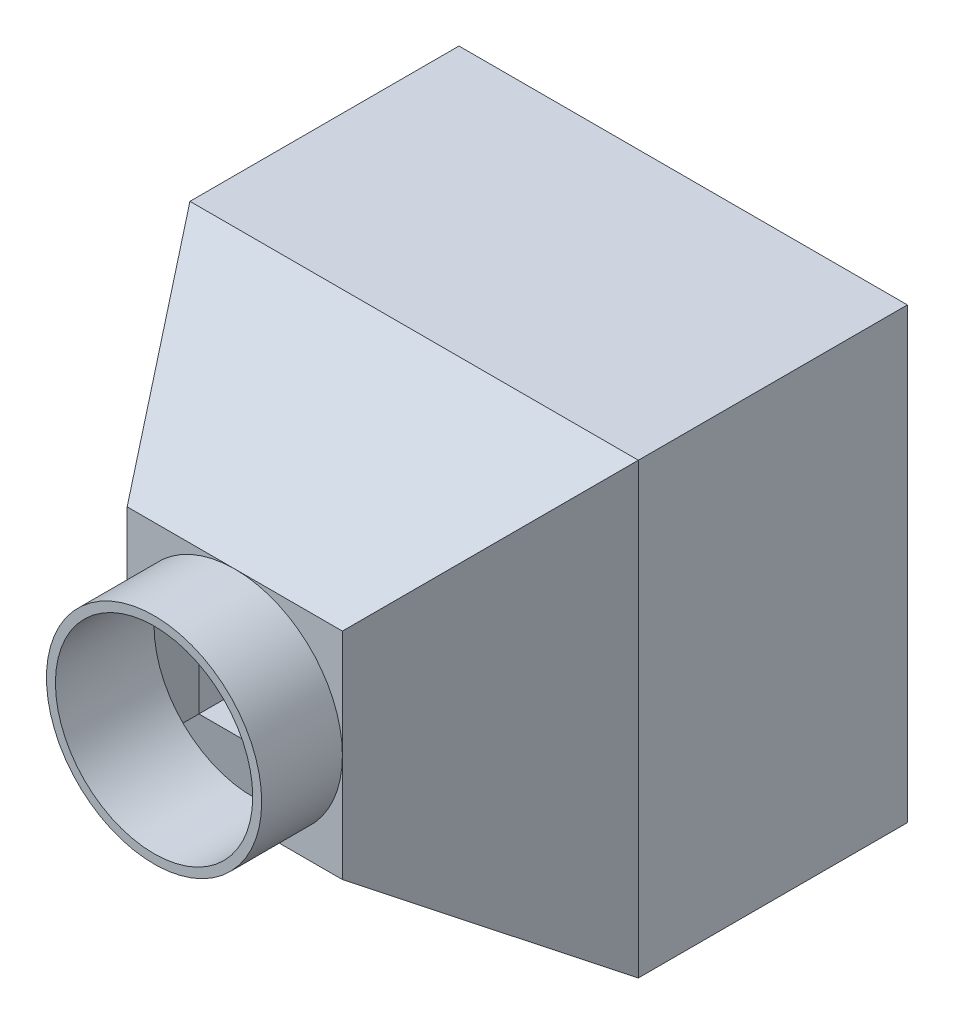
ISO-10303-21;
HEADER;
FILE_DESCRIPTION(('STEP AP214'),'2;1');
FILE_NAME('part.step','',(''),(''),'','','');
FILE_SCHEMA(('AUTOMOTIVE_DESIGN { 1 0 10303 214 1 1 1 1 }'));
ENDSEC;
DATA;
#1=APPLICATION_CONTEXT('core data for automotive mechanical design processes');
#2=APPLICATION_PROTOCOL_DEFINITION('international standard','automotive_design',2000,#1);
#3=PRODUCT_CONTEXT('',#1,'mechanical');
#4=PRODUCT('Part','Part','',(#3));
#5=PRODUCT_RELATED_PRODUCT_CATEGORY('part','',(#4));
#6=PRODUCT_DEFINITION_FORMATION('','',#4);
#7=PRODUCT_DEFINITION_CONTEXT('part definition',#1,'design');
#8=PRODUCT_DEFINITION('design','',#6,#7);
#9=PRODUCT_DEFINITION_SHAPE('','',#8);
#10=(LENGTH_UNIT() NAMED_UNIT(*) SI_UNIT(.MILLI.,.METRE.));
#11=(NAMED_UNIT(*) PLANE_ANGLE_UNIT() SI_UNIT($,.RADIAN.));
#12=(NAMED_UNIT(*) SI_UNIT($,.STERADIAN.) SOLID_ANGLE_UNIT());
#13=UNCERTAINTY_MEASURE_WITH_UNIT(LENGTH_MEASURE(1.E-05),#10,'distance_accuracy_value','');
#14=(GEOMETRIC_REPRESENTATION_CONTEXT(3) GLOBAL_UNCERTAINTY_ASSIGNED_CONTEXT((#13)) GLOBAL_UNIT_ASSIGNED_CONTEXT((#10,
#11,#12)) REPRESENTATION_CONTEXT('',''));
#15=CARTESIAN_POINT('',(0.,0.,0.));
#16=DIRECTION('',(0.,0.,1.));
#17=DIRECTION('',(1.,0.,0.));
#18=AXIS2_PLACEMENT_3D('',#15,#16,#17);
#19=CARTESIAN_POINT('',(0.,0.,59.));
#20=DIRECTION('',(0.,0.,-1.));
#21=DIRECTION('',(-1.,0.,0.));
#22=AXIS2_PLACEMENT_3D('',#19,#20,#21);
#23=CYLINDRICAL_SURFACE('',#22,11.);
#24=CARTESIAN_POINT('',(0.,0.,59.));
#25=DIRECTION('',(0.,0.,1.));
#26=DIRECTION('',(1.,0.,0.));
#27=AXIS2_PLACEMENT_3D('',#24,#25,#26);
#28=CIRCLE('',#27,11.);
#29=CARTESIAN_POINT('',(11.,0.,59.));
#30=VERTEX_POINT('',#29);
#31=EDGE_CURVE('E220',#30,#30,#28,.T.);
#32=ORIENTED_EDGE('',*,*,#31,.T.);
#33=EDGE_LOOP('',(#32));
#34=FACE_BOUND('',#33,.T.);
#35=CARTESIAN_POINT('',(0.,0.,48.));
#36=DIRECTION('',(0.,0.,-1.));
#37=DIRECTION('',(-1.,0.,0.));
#38=AXIS2_PLACEMENT_3D('',#35,#36,#37);
#39=CIRCLE('',#38,11.);
#40=CARTESIAN_POINT('',(-11.,0.,48.));
#41=VERTEX_POINT('',#40);
#42=EDGE_CURVE('E41',#41,#41,#39,.T.);
#43=ORIENTED_EDGE('',*,*,#42,.T.);
#44=EDGE_LOOP('',(#43));
#45=FACE_BOUND('',#44,.T.);
#46=ADVANCED_FACE('F37',(#34,#45),#23,.F.);
#47=CARTESIAN_POINT('',(0.,0.,50.));
#48=DIRECTION('',(0.,0.,1.));
#49=DIRECTION('',(1.,0.,0.));
#50=AXIS2_PLACEMENT_3D('',#47,#48,#49);
#51=PLANE('',#50);
#52=DIRECTION('',(1.,0.,0.));
#53=VECTOR('',#52,1.);
#54=CARTESIAN_POINT('',(-48.8537208837531,-12.,50.));
#55=LINE('',#54,#53);
#56=CARTESIAN_POINT('',(0.,-12.,50.));
#57=VERTEX_POINT('',#56);
#58=CARTESIAN_POINT('',(12.,-12.,50.));
#59=VERTEX_POINT('',#58);
#60=EDGE_CURVE('E190',#57,#59,#55,.T.);
#61=ORIENTED_EDGE('',*,*,#60,.T.);
#62=DIRECTION('',(0.,-1.,0.));
#63=VECTOR('',#62,1.);
#64=CARTESIAN_POINT('',(12.,48.8537208837531,50.));
#65=LINE('',#64,#63);
#66=CARTESIAN_POINT('',(12.,0.,50.));
#67=VERTEX_POINT('',#66);
#68=EDGE_CURVE('E214',#67,#59,#65,.T.);
#69=ORIENTED_EDGE('',*,*,#68,.F.);
#70=CARTESIAN_POINT('',(0.,0.,50.));
#71=DIRECTION('',(0.,0.,1.));
#72=DIRECTION('',(1.,0.,0.));
#73=AXIS2_PLACEMENT_3D('',#70,#71,#72);
#74=CIRCLE('',#73,12.);
#75=EDGE_CURVE('E234',#57,#67,#74,.T.);
#76=ORIENTED_EDGE('',*,*,#75,.F.);
#77=EDGE_LOOP('',(#61,#69,#76));
#78=FACE_BOUND('',#77,.T.);
#79=ADVANCED_FACE('F284',(#78),#51,.T.);
#80=DIRECTION('',(1.,0.,0.));
#81=VECTOR('',#80,1.);
#82=CARTESIAN_POINT('',(-48.8537208837531,12.,50.));
#83=LINE('',#82,#81);
#84=CARTESIAN_POINT('',(-12.,12.,50.));
#85=VERTEX_POINT('',#84);
#86=CARTESIAN_POINT('',(0.,12.,50.));
#87=VERTEX_POINT('',#86);
#88=EDGE_CURVE('E203',#85,#87,#83,.T.);
#89=ORIENTED_EDGE('',*,*,#88,.F.);
#90=DIRECTION('',(0.,-1.,0.));
#91=VECTOR('',#90,1.);
#92=CARTESIAN_POINT('',(-12.,48.8537208837531,50.));
#93=LINE('',#92,#91);
#94=CARTESIAN_POINT('',(-12.,0.,50.));
#95=VERTEX_POINT('',#94);
#96=EDGE_CURVE('E221',#85,#95,#93,.T.);
#97=ORIENTED_EDGE('',*,*,#96,.T.);
#98=EDGE_CURVE('E226',#87,#95,#74,.T.);
#99=ORIENTED_EDGE('',*,*,#98,.F.);
#100=EDGE_LOOP('',(#89,#97,#99));
#101=FACE_BOUND('',#100,.T.);
#102=ADVANCED_FACE('F274',(#101),#51,.T.);
#103=CARTESIAN_POINT('',(12.,12.,50.));
#104=VERTEX_POINT('',#103);
#105=EDGE_CURVE('E61',#87,#104,#83,.T.);
#106=ORIENTED_EDGE('',*,*,#105,.F.);
#107=EDGE_CURVE('E235',#67,#87,#74,.T.);
#108=ORIENTED_EDGE('',*,*,#107,.F.);
#109=EDGE_CURVE('E210',#104,#67,#65,.T.);
#110=ORIENTED_EDGE('',*,*,#109,.F.);
#111=EDGE_LOOP('',(#106,#108,#110));
#112=FACE_BOUND('',#111,.T.);
#113=ADVANCED_FACE('F264',(#112),#51,.T.);
#114=CARTESIAN_POINT('',(-25.,25.,50.));
#115=DIRECTION('',(1.,0.,0.));
#116=DIRECTION('',(0.,1.,0.));
#117=AXIS2_PLACEMENT_3D('',#114,#115,#116);
#118=PLANE('',#117);
#119=DIRECTION('',(0.,0.,-1.));
#120=VECTOR('',#119,1.);
#121=CARTESIAN_POINT('',(-25.,-25.,50.));
#122=LINE('',#121,#120);
#123=CARTESIAN_POINT('',(-25.,-25.,30.));
#124=VERTEX_POINT('',#123);
#125=CARTESIAN_POINT('',(-25.,-25.,0.));
#126=VERTEX_POINT('',#125);
#127=EDGE_CURVE('E253',#124,#126,#122,.T.);
#128=ORIENTED_EDGE('',*,*,#127,.F.);
#129=DIRECTION('',(0.,-1.,0.));
#130=VECTOR('',#129,1.);
#131=CARTESIAN_POINT('',(-25.,48.8537208837531,30.));
#132=LINE('',#131,#130);
#133=CARTESIAN_POINT('',(-25.,25.,30.));
#134=VERTEX_POINT('',#133);
#135=EDGE_CURVE('E217',#134,#124,#132,.T.);
#136=ORIENTED_EDGE('',*,*,#135,.F.);
#137=DIRECTION('',(0.,0.,-1.));
#138=VECTOR('',#137,1.);
#139=CARTESIAN_POINT('',(-25.,25.,50.));
#140=LINE('',#139,#138);
#141=CARTESIAN_POINT('',(-25.,25.,0.));
#142=VERTEX_POINT('',#141);
#143=EDGE_CURVE('E247',#134,#142,#140,.T.);
#144=ORIENTED_EDGE('',*,*,#143,.T.);
#145=DIRECTION('',(0.,-1.,0.));
#146=VECTOR('',#145,1.);
#147=CARTESIAN_POINT('',(-25.,25.,0.));
#148=LINE('',#147,#146);
#149=EDGE_CURVE('E230',#142,#126,#148,.T.);
#150=ORIENTED_EDGE('',*,*,#149,.T.);
#151=EDGE_LOOP('',(#128,#136,#144,#150));
#152=FACE_BOUND('',#151,.T.);
#153=ADVANCED_FACE('F39',(#152),#118,.F.);
#154=CARTESIAN_POINT('',(-25.,-25.,50.));
#155=DIRECTION('',(0.,1.,0.));
#156=DIRECTION('',(-1.,0.,0.));
#157=AXIS2_PLACEMENT_3D('',#154,#155,#156);
#158=PLANE('',#157);
#159=DIRECTION('',(0.,0.,-1.));
#160=VECTOR('',#159,1.);
#161=CARTESIAN_POINT('',(25.,-25.,50.));
#162=LINE('',#161,#160);
#163=CARTESIAN_POINT('',(25.,-25.,30.));
#164=VERTEX_POINT('',#163);
#165=CARTESIAN_POINT('',(25.,-25.,0.));
#166=VERTEX_POINT('',#165);
#167=EDGE_CURVE('E251',#164,#166,#162,.T.);
#168=ORIENTED_EDGE('',*,*,#167,.F.);
#169=DIRECTION('',(1.,0.,0.));
#170=VECTOR('',#169,1.);
#171=CARTESIAN_POINT('',(-48.8537208837531,-25.,30.));
#172=LINE('',#171,#170);
#173=EDGE_CURVE('E193',#124,#164,#172,.T.);
#174=ORIENTED_EDGE('',*,*,#173,.F.);
#175=ORIENTED_EDGE('',*,*,#127,.T.);
#176=DIRECTION('',(1.,0.,0.));
#177=VECTOR('',#176,1.);
#178=CARTESIAN_POINT('',(-25.,-25.,0.));
#179=LINE('',#178,#177);
#180=EDGE_CURVE('E238',#126,#166,#179,.T.);
#181=ORIENTED_EDGE('',*,*,#180,.T.);
#182=EDGE_LOOP('',(#168,#174,#175,#181));
#183=FACE_BOUND('',#182,.T.);
#184=ADVANCED_FACE('F290',(#183),#158,.F.);
#185=CARTESIAN_POINT('',(25.,25.,50.));
#186=DIRECTION('',(-1.,0.,0.));
#187=DIRECTION('',(0.,-1.,0.));
#188=AXIS2_PLACEMENT_3D('',#185,#186,#187);
#189=PLANE('',#188);
#190=DIRECTION('',(0.,0.,-1.));
#191=VECTOR('',#190,1.);
#192=CARTESIAN_POINT('',(25.,25.,50.));
#193=LINE('',#192,#191);
#194=CARTESIAN_POINT('',(25.,25.,30.));
#195=VERTEX_POINT('',#194);
#196=CARTESIAN_POINT('',(25.,25.,0.));
#197=VERTEX_POINT('',#196);
#198=EDGE_CURVE('E249',#195,#197,#193,.T.);
#199=ORIENTED_EDGE('',*,*,#198,.F.);
#200=DIRECTION('',(0.,-1.,0.));
#201=VECTOR('',#200,1.);
#202=CARTESIAN_POINT('',(25.,48.8537208837531,30.));
#203=LINE('',#202,#201);
#204=EDGE_CURVE('E209',#195,#164,#203,.T.);
#205=ORIENTED_EDGE('',*,*,#204,.T.);
#206=ORIENTED_EDGE('',*,*,#167,.T.);
#207=DIRECTION('',(0.,1.,0.));
#208=VECTOR('',#207,1.);
#209=CARTESIAN_POINT('',(25.,25.,0.));
#210=LINE('',#209,#208);
#211=EDGE_CURVE('E241',#166,#197,#210,.T.);
#212=ORIENTED_EDGE('',*,*,#211,.T.);
#213=EDGE_LOOP('',(#199,#205,#206,#212));
#214=FACE_BOUND('',#213,.T.);
#215=ADVANCED_FACE('F287',(#214),#189,.F.);
#216=CARTESIAN_POINT('',(-25.,25.,50.));
#217=DIRECTION('',(0.,-1.,0.));
#218=DIRECTION('',(1.,0.,0.));
#219=AXIS2_PLACEMENT_3D('',#216,#217,#218);
#220=PLANE('',#219);
#221=ORIENTED_EDGE('',*,*,#143,.F.);
#222=DIRECTION('',(1.,0.,0.));
#223=VECTOR('',#222,1.);
#224=CARTESIAN_POINT('',(-48.8537208837531,25.,30.));
#225=LINE('',#224,#223);
#226=EDGE_CURVE('E201',#134,#195,#225,.T.);
#227=ORIENTED_EDGE('',*,*,#226,.T.);
#228=ORIENTED_EDGE('',*,*,#198,.T.);
#229=DIRECTION('',(-1.,0.,0.));
#230=VECTOR('',#229,1.);
#231=CARTESIAN_POINT('',(-25.,25.,0.));
#232=LINE('',#231,#230);
#233=EDGE_CURVE('E244',#197,#142,#232,.T.);
#234=ORIENTED_EDGE('',*,*,#233,.T.);
#235=EDGE_LOOP('',(#221,#227,#228,#234));
#236=FACE_BOUND('',#235,.T.);
#237=ADVANCED_FACE('F300',(#236),#220,.F.);
#238=CARTESIAN_POINT('',(-12.,-12.,50.));
#239=VERTEX_POINT('',#238);
#240=EDGE_CURVE('E196',#239,#57,#55,.T.);
#241=ORIENTED_EDGE('',*,*,#240,.T.);
#242=EDGE_CURVE('E231',#95,#57,#74,.T.);
#243=ORIENTED_EDGE('',*,*,#242,.F.);
#244=EDGE_CURVE('E213',#95,#239,#93,.T.);
#245=ORIENTED_EDGE('',*,*,#244,.T.);
#246=EDGE_LOOP('',(#241,#243,#245));
#247=FACE_BOUND('',#246,.T.);
#248=ADVANCED_FACE('F280',(#247),#51,.T.);
#249=CARTESIAN_POINT('',(0.,0.,0.));
#250=DIRECTION('',(0.,0.,1.));
#251=DIRECTION('',(1.,0.,0.));
#252=AXIS2_PLACEMENT_3D('',#249,#250,#251);
#253=PLANE('',#252);
#254=DIRECTION('',(1.,0.,0.));
#255=VECTOR('',#254,1.);
#256=CARTESIAN_POINT('',(24.,24.,0.));
#257=LINE('',#256,#255);
#258=CARTESIAN_POINT('',(-24.,24.,0.));
#259=VERTEX_POINT('',#258);
#260=CARTESIAN_POINT('',(24.,24.,0.));
#261=VERTEX_POINT('',#260);
#262=EDGE_CURVE('E166',#259,#261,#257,.T.);
#263=ORIENTED_EDGE('',*,*,#262,.F.);
#264=DIRECTION('',(0.,1.,0.));
#265=VECTOR('',#264,1.);
#266=CARTESIAN_POINT('',(-24.,-24.,0.));
#267=LINE('',#266,#265);
#268=CARTESIAN_POINT('',(-24.,-24.,0.));
#269=VERTEX_POINT('',#268);
#270=EDGE_CURVE('E53',#269,#259,#267,.T.);
#271=ORIENTED_EDGE('',*,*,#270,.F.);
#272=DIRECTION('',(-1.,0.,0.));
#273=VECTOR('',#272,1.);
#274=CARTESIAN_POINT('',(24.,-24.,0.));
#275=LINE('',#274,#273);
#276=CARTESIAN_POINT('',(24.,-24.,0.));
#277=VERTEX_POINT('',#276);
#278=EDGE_CURVE('E185',#277,#269,#275,.T.);
#279=ORIENTED_EDGE('',*,*,#278,.F.);
#280=DIRECTION('',(0.,-1.,0.));
#281=VECTOR('',#280,1.);
#282=CARTESIAN_POINT('',(24.,-24.,0.));
#283=LINE('',#282,#281);
#284=EDGE_CURVE('E183',#261,#277,#283,.T.);
#285=ORIENTED_EDGE('',*,*,#284,.F.);
#286=EDGE_LOOP('',(#263,#271,#279,#285));
#287=FACE_BOUND('',#286,.T.);
#288=ORIENTED_EDGE('',*,*,#149,.F.);
#289=ORIENTED_EDGE('',*,*,#233,.F.);
#290=ORIENTED_EDGE('',*,*,#211,.F.);
#291=ORIENTED_EDGE('',*,*,#180,.F.);
#292=EDGE_LOOP('',(#288,#289,#290,#291));
#293=FACE_BOUND('',#292,.T.);
#294=ADVANCED_FACE('F297',(#287,#293),#253,.F.);
#295=CARTESIAN_POINT('',(0.,0.,59.));
#296=DIRECTION('',(0.,0.,1.));
#297=DIRECTION('',(1.,0.,0.));
#298=AXIS2_PLACEMENT_3D('',#295,#296,#297);
#299=PLANE('',#298);
#300=CARTESIAN_POINT('',(0.,0.,59.));
#301=DIRECTION('',(0.,0.,1.));
#302=DIRECTION('',(1.,0.,0.));
#303=AXIS2_PLACEMENT_3D('',#300,#301,#302);
#304=CIRCLE('',#303,12.);
#305=CARTESIAN_POINT('',(12.,0.,59.));
#306=VERTEX_POINT('',#305);
#307=EDGE_CURVE('E227',#306,#306,#304,.T.);
#308=ORIENTED_EDGE('',*,*,#307,.T.);
#309=EDGE_LOOP('',(#308));
#310=FACE_BOUND('',#309,.T.);
#311=ORIENTED_EDGE('',*,*,#31,.F.);
#312=EDGE_LOOP('',(#311));
#313=FACE_BOUND('',#312,.T.);
#314=ADVANCED_FACE('F320',(#310,#313),#299,.T.);
#315=CARTESIAN_POINT('',(0.,0.,59.));
#316=DIRECTION('',(0.,0.,-1.));
#317=DIRECTION('',(-1.,0.,0.));
#318=AXIS2_PLACEMENT_3D('',#315,#316,#317);
#319=CYLINDRICAL_SURFACE('',#318,12.);
#320=ORIENTED_EDGE('',*,*,#307,.F.);
#321=EDGE_LOOP('',(#320));
#322=FACE_BOUND('',#321,.T.);
#323=ORIENTED_EDGE('',*,*,#242,.T.);
#324=ORIENTED_EDGE('',*,*,#75,.T.);
#325=ORIENTED_EDGE('',*,*,#107,.T.);
#326=ORIENTED_EDGE('',*,*,#98,.T.);
#327=EDGE_LOOP('',(#323,#324,#325,#326));
#328=FACE_BOUND('',#327,.T.);
#329=ADVANCED_FACE('F268',(#322,#328),#319,.T.);
#330=CARTESIAN_POINT('',(-25.,48.8537208837531,30.));
#331=DIRECTION('',(0.838443616300637,0.,-0.544988350595414));
#332=DIRECTION('',(-0.544988350595414,0.,-0.838443616300637));
#333=AXIS2_PLACEMENT_3D('',#330,#331,#332);
#334=PLANE('',#333);
#335=ORIENTED_EDGE('',*,*,#135,.T.);
#336=DIRECTION('',(0.478536612991002,0.478536612991002,0.73621017383231));
#337=VECTOR('',#336,1.);
#338=CARTESIAN_POINT('',(-8.08769806320557,-8.08769806320556,56.0189260566068));
#339=LINE('',#338,#337);
#340=EDGE_CURVE('E195',#124,#239,#339,.T.);
#341=ORIENTED_EDGE('',*,*,#340,.T.);
#342=ORIENTED_EDGE('',*,*,#244,.F.);
#343=ORIENTED_EDGE('',*,*,#96,.F.);
#344=DIRECTION('',(-0.478536612991002,0.478536612991001,-0.73621017383231));
#345=VECTOR('',#344,1.);
#346=CARTESIAN_POINT('',(-30.4624374381494,30.4624374381494,21.5962500951547));
#347=LINE('',#346,#345);
#348=EDGE_CURVE('E206',#85,#134,#347,.T.);
#349=ORIENTED_EDGE('',*,*,#348,.T.);
#350=EDGE_LOOP('',(#335,#341,#342,#343,#349));
#351=FACE_BOUND('',#350,.T.);
#352=ADVANCED_FACE('F277',(#351),#334,.F.);
#353=CARTESIAN_POINT('',(25.,48.8537208837531,30.));
#354=DIRECTION('',(-0.838443616300637,0.,-0.544988350595414));
#355=DIRECTION('',(-0.544988350595414,0.,0.838443616300637));
#356=AXIS2_PLACEMENT_3D('',#353,#354,#355);
#357=PLANE('',#356);
#358=ORIENTED_EDGE('',*,*,#68,.T.);
#359=DIRECTION('',(0.478536612991002,-0.478536612991002,-0.73621017383231));
#360=VECTOR('',#359,1.);
#361=CARTESIAN_POINT('',(8.08769806320558,-8.08769806320558,56.0189260566068));
#362=LINE('',#361,#360);
#363=EDGE_CURVE('E11',#59,#164,#362,.T.);
#364=ORIENTED_EDGE('',*,*,#363,.T.);
#365=ORIENTED_EDGE('',*,*,#204,.F.);
#366=DIRECTION('',(-0.478536612991002,-0.478536612991001,0.73621017383231));
#367=VECTOR('',#366,1.);
#368=CARTESIAN_POINT('',(30.4624374381494,30.4624374381494,21.5962500951547));
#369=LINE('',#368,#367);
#370=EDGE_CURVE('E46',#195,#104,#369,.T.);
#371=ORIENTED_EDGE('',*,*,#370,.T.);
#372=ORIENTED_EDGE('',*,*,#109,.T.);
#373=EDGE_LOOP('',(#358,#364,#365,#371,#372));
#374=FACE_BOUND('',#373,.T.);
#375=ADVANCED_FACE('F259',(#374),#357,.F.);
#376=CARTESIAN_POINT('',(-48.8537208837531,25.,30.));
#377=DIRECTION('',(0.,-0.838443616300637,-0.544988350595414));
#378=DIRECTION('',(0.,0.544988350595414,-0.838443616300637));
#379=AXIS2_PLACEMENT_3D('',#376,#377,#378);
#380=PLANE('',#379);
#381=ORIENTED_EDGE('',*,*,#88,.T.);
#382=ORIENTED_EDGE('',*,*,#105,.T.);
#383=ORIENTED_EDGE('',*,*,#370,.F.);
#384=ORIENTED_EDGE('',*,*,#226,.F.);
#385=ORIENTED_EDGE('',*,*,#348,.F.);
#386=EDGE_LOOP('',(#381,#382,#383,#384,#385));
#387=FACE_BOUND('',#386,.T.);
#388=ADVANCED_FACE('F301',(#387),#380,.F.);
#389=CARTESIAN_POINT('',(-48.8537208837531,-25.,30.));
#390=DIRECTION('',(0.,0.838443616300637,-0.544988350595414));
#391=DIRECTION('',(0.,0.544988350595414,0.838443616300637));
#392=AXIS2_PLACEMENT_3D('',#389,#390,#391);
#393=PLANE('',#392);
#394=ORIENTED_EDGE('',*,*,#173,.T.);
#395=ORIENTED_EDGE('',*,*,#363,.F.);
#396=ORIENTED_EDGE('',*,*,#60,.F.);
#397=ORIENTED_EDGE('',*,*,#240,.F.);
#398=ORIENTED_EDGE('',*,*,#340,.F.);
#399=EDGE_LOOP('',(#394,#395,#396,#397,#398));
#400=FACE_BOUND('',#399,.T.);
#401=ADVANCED_FACE('F376',(#400),#393,.F.);
#402=CARTESIAN_POINT('',(-24.,-24.,30.));
#403=DIRECTION('',(-1.,0.,0.));
#404=DIRECTION('',(0.,0.,1.));
#405=AXIS2_PLACEMENT_3D('',#402,#403,#404);
#406=PLANE('',#405);
#407=ORIENTED_EDGE('',*,*,#270,.T.);
#408=DIRECTION('',(0.,0.,-1.));
#409=VECTOR('',#408,1.);
#410=CARTESIAN_POINT('',(-24.,24.,30.));
#411=LINE('',#410,#409);
#412=CARTESIAN_POINT('',(-24.,24.,30.));
#413=VERTEX_POINT('',#412);
#414=EDGE_CURVE('E171',#413,#259,#411,.T.);
#415=ORIENTED_EDGE('',*,*,#414,.F.);
#416=DIRECTION('',(0.,1.,0.));
#417=VECTOR('',#416,1.);
#418=CARTESIAN_POINT('',(-24.,-24.,30.));
#419=LINE('',#418,#417);
#420=CARTESIAN_POINT('',(-24.,-24.,30.));
#421=VERTEX_POINT('',#420);
#422=EDGE_CURVE('E160',#421,#413,#419,.T.);
#423=ORIENTED_EDGE('',*,*,#422,.F.);
#424=DIRECTION('',(0.,0.,-1.));
#425=VECTOR('',#424,1.);
#426=CARTESIAN_POINT('',(-24.,-24.,30.));
#427=LINE('',#426,#425);
#428=EDGE_CURVE('E188',#421,#269,#427,.T.);
#429=ORIENTED_EDGE('',*,*,#428,.T.);
#430=EDGE_LOOP('',(#407,#415,#423,#429));
#431=FACE_BOUND('',#430,.T.);
#432=ADVANCED_FACE('F382',(#431),#406,.F.);
#433=CARTESIAN_POINT('',(24.,-24.,30.));
#434=DIRECTION('',(0.,-1.,0.));
#435=DIRECTION('',(0.,0.,-1.));
#436=AXIS2_PLACEMENT_3D('',#433,#434,#435);
#437=PLANE('',#436);
#438=ORIENTED_EDGE('',*,*,#278,.T.);
#439=ORIENTED_EDGE('',*,*,#428,.F.);
#440=DIRECTION('',(-1.,0.,0.));
#441=VECTOR('',#440,1.);
#442=CARTESIAN_POINT('',(24.,-24.,30.));
#443=LINE('',#442,#441);
#444=CARTESIAN_POINT('',(24.,-24.,30.));
#445=VERTEX_POINT('',#444);
#446=EDGE_CURVE('E175',#445,#421,#443,.T.);
#447=ORIENTED_EDGE('',*,*,#446,.F.);
#448=DIRECTION('',(0.,0.,-1.));
#449=VECTOR('',#448,1.);
#450=CARTESIAN_POINT('',(24.,-24.,30.));
#451=LINE('',#450,#449);
#452=EDGE_CURVE('E170',#445,#277,#451,.T.);
#453=ORIENTED_EDGE('',*,*,#452,.T.);
#454=EDGE_LOOP('',(#438,#439,#447,#453));
#455=FACE_BOUND('',#454,.T.);
#456=ADVANCED_FACE('F389',(#455),#437,.F.);
#457=CARTESIAN_POINT('',(24.,-24.,30.));
#458=DIRECTION('',(1.,0.,0.));
#459=DIRECTION('',(0.,0.,-1.));
#460=AXIS2_PLACEMENT_3D('',#457,#458,#459);
#461=PLANE('',#460);
#462=ORIENTED_EDGE('',*,*,#284,.T.);
#463=ORIENTED_EDGE('',*,*,#452,.F.);
#464=DIRECTION('',(0.,-1.,0.));
#465=VECTOR('',#464,1.);
#466=CARTESIAN_POINT('',(24.,-24.,30.));
#467=LINE('',#466,#465);
#468=CARTESIAN_POINT('',(24.,24.,30.));
#469=VERTEX_POINT('',#468);
#470=EDGE_CURVE('E144',#469,#445,#467,.T.);
#471=ORIENTED_EDGE('',*,*,#470,.F.);
#472=DIRECTION('',(0.,0.,-1.));
#473=VECTOR('',#472,1.);
#474=CARTESIAN_POINT('',(24.,24.,30.));
#475=LINE('',#474,#473);
#476=EDGE_CURVE('E163',#469,#261,#475,.T.);
#477=ORIENTED_EDGE('',*,*,#476,.T.);
#478=EDGE_LOOP('',(#462,#463,#471,#477));
#479=FACE_BOUND('',#478,.T.);
#480=ADVANCED_FACE('F173',(#479),#461,.F.);
#481=CARTESIAN_POINT('',(24.,24.,30.));
#482=DIRECTION('',(0.,1.,0.));
#483=DIRECTION('',(0.,0.,1.));
#484=AXIS2_PLACEMENT_3D('',#481,#482,#483);
#485=PLANE('',#484);
#486=ORIENTED_EDGE('',*,*,#262,.T.);
#487=ORIENTED_EDGE('',*,*,#476,.F.);
#488=DIRECTION('',(1.,0.,0.));
#489=VECTOR('',#488,1.);
#490=CARTESIAN_POINT('',(24.,24.,30.));
#491=LINE('',#490,#489);
#492=EDGE_CURVE('E156',#413,#469,#491,.T.);
#493=ORIENTED_EDGE('',*,*,#492,.F.);
#494=ORIENTED_EDGE('',*,*,#414,.T.);
#495=EDGE_LOOP('',(#486,#487,#493,#494));
#496=FACE_BOUND('',#495,.T.);
#497=ADVANCED_FACE('F164',(#496),#485,.F.);
#498=CARTESIAN_POINT('',(-24.,24.,30.));
#499=DIRECTION('',(-0.838670567945423,0.,0.544639035015028));
#500=DIRECTION('',(0.544639035015028,0.,0.838670567945423));
#501=AXIS2_PLACEMENT_3D('',#498,#499,#500);
#502=PLANE('',#501);
#503=ORIENTED_EDGE('',*,*,#422,.T.);
#504=DIRECTION('',(-0.47830007689565,0.47830007689565,-0.736517530601431));
#505=VECTOR('',#504,1.);
#506=CARTESIAN_POINT('',(-24.,24.,30.));
#507=LINE('',#506,#505);
#508=CARTESIAN_POINT('',(-12.3106633224448,12.3106633224448,48.));
#509=VERTEX_POINT('',#508);
#510=EDGE_CURVE('E152',#509,#413,#507,.T.);
#511=ORIENTED_EDGE('',*,*,#510,.F.);
#512=DIRECTION('',(0.,1.,0.));
#513=VECTOR('',#512,1.);
#514=CARTESIAN_POINT('',(-12.3106633224448,0.,48.));
#515=LINE('',#514,#513);
#516=CARTESIAN_POINT('',(-12.3106633224448,-12.3106633224448,48.));
#517=VERTEX_POINT('',#516);
#518=EDGE_CURVE('E524',#517,#509,#515,.T.);
#519=ORIENTED_EDGE('',*,*,#518,.F.);
#520=DIRECTION('',(-0.47830007689565,-0.47830007689565,-0.736517530601431));
#521=VECTOR('',#520,1.);
#522=CARTESIAN_POINT('',(-13.0189937491975,-13.0189937491975,46.9092667930396));
#523=LINE('',#522,#521);
#524=EDGE_CURVE('E534',#517,#421,#523,.T.);
#525=ORIENTED_EDGE('',*,*,#524,.T.);
#526=EDGE_LOOP('',(#503,#511,#519,#525));
#527=FACE_BOUND('',#526,.T.);
#528=ADVANCED_FACE('F409',(#527),#502,.F.);
#529=CARTESIAN_POINT('',(24.,-24.,30.));
#530=DIRECTION('',(0.,-0.838670567945423,0.544639035015028));
#531=DIRECTION('',(0.,-0.544639035015028,-0.838670567945423));
#532=AXIS2_PLACEMENT_3D('',#529,#530,#531);
#533=PLANE('',#532);
#534=ORIENTED_EDGE('',*,*,#446,.T.);
#535=ORIENTED_EDGE('',*,*,#524,.F.);
#536=DIRECTION('',(-1.,0.,0.));
#537=VECTOR('',#536,1.);
#538=CARTESIAN_POINT('',(0.,-12.3106633224448,48.));
#539=LINE('',#538,#537);
#540=CARTESIAN_POINT('',(12.3106633224448,-12.3106633224448,48.));
#541=VERTEX_POINT('',#540);
#542=EDGE_CURVE('E527',#541,#517,#539,.T.);
#543=ORIENTED_EDGE('',*,*,#542,.F.);
#544=DIRECTION('',(0.47830007689565,-0.47830007689565,-0.736517530601431));
#545=VECTOR('',#544,1.);
#546=CARTESIAN_POINT('',(13.0189937491975,-13.0189937491975,46.9092667930396));
#547=LINE('',#546,#545);
#548=EDGE_CURVE('E151',#541,#445,#547,.T.);
#549=ORIENTED_EDGE('',*,*,#548,.T.);
#550=EDGE_LOOP('',(#534,#535,#543,#549));
#551=FACE_BOUND('',#550,.T.);
#552=ADVANCED_FACE('F416',(#551),#533,.F.);
#553=CARTESIAN_POINT('',(24.,24.,30.));
#554=DIRECTION('',(0.838670567945423,0.,0.544639035015028));
#555=DIRECTION('',(0.544639035015028,0.,-0.838670567945423));
#556=AXIS2_PLACEMENT_3D('',#553,#554,#555);
#557=PLANE('',#556);
#558=ORIENTED_EDGE('',*,*,#470,.T.);
#559=ORIENTED_EDGE('',*,*,#548,.F.);
#560=DIRECTION('',(0.,-1.,0.));
#561=VECTOR('',#560,1.);
#562=CARTESIAN_POINT('',(12.3106633224448,0.,48.));
#563=LINE('',#562,#561);
#564=CARTESIAN_POINT('',(12.3106633224448,12.3106633224448,48.));
#565=VERTEX_POINT('',#564);
#566=EDGE_CURVE('E147',#565,#541,#563,.T.);
#567=ORIENTED_EDGE('',*,*,#566,.F.);
#568=DIRECTION('',(0.47830007689565,0.47830007689565,-0.736517530601431));
#569=VECTOR('',#568,1.);
#570=CARTESIAN_POINT('',(24.,24.,30.));
#571=LINE('',#570,#569);
#572=EDGE_CURVE('E140',#565,#469,#571,.T.);
#573=ORIENTED_EDGE('',*,*,#572,.T.);
#574=EDGE_LOOP('',(#558,#559,#567,#573));
#575=FACE_BOUND('',#574,.T.);
#576=ADVANCED_FACE('F142',(#575),#557,.F.);
#577=CARTESIAN_POINT('',(24.,24.,30.));
#578=DIRECTION('',(0.,0.838670567945423,0.544639035015028));
#579=DIRECTION('',(0.,-0.544639035015028,0.838670567945423));
#580=AXIS2_PLACEMENT_3D('',#577,#578,#579);
#581=PLANE('',#580);
#582=ORIENTED_EDGE('',*,*,#492,.T.);
#583=ORIENTED_EDGE('',*,*,#572,.F.);
#584=DIRECTION('',(1.,0.,0.));
#585=VECTOR('',#584,1.);
#586=CARTESIAN_POINT('',(0.,12.3106633224448,48.));
#587=LINE('',#586,#585);
#588=EDGE_CURVE('E525',#509,#565,#587,.T.);
#589=ORIENTED_EDGE('',*,*,#588,.F.);
#590=ORIENTED_EDGE('',*,*,#510,.T.);
#591=EDGE_LOOP('',(#582,#583,#589,#590));
#592=FACE_BOUND('',#591,.T.);
#593=ADVANCED_FACE('F158',(#592),#581,.F.);
#594=CARTESIAN_POINT('',(0.,0.,48.));
#595=DIRECTION('',(0.,0.,-1.));
#596=DIRECTION('',(-1.,0.,0.));
#597=AXIS2_PLACEMENT_3D('',#594,#595,#596);
#598=PLANE('',#597);
#599=ORIENTED_EDGE('',*,*,#42,.F.);
#600=EDGE_LOOP('',(#599));
#601=FACE_BOUND('',#600,.T.);
#602=ORIENTED_EDGE('',*,*,#518,.T.);
#603=ORIENTED_EDGE('',*,*,#588,.T.);
#604=ORIENTED_EDGE('',*,*,#566,.T.);
#605=ORIENTED_EDGE('',*,*,#542,.T.);
#606=EDGE_LOOP('',(#602,#603,#604,#605));
#607=FACE_BOUND('',#606,.T.);
#608=ADVANCED_FACE('F437',(#601,#607),#598,.T.);
#609=CLOSED_SHELL('',(#46,#79,#102,#113,#153,#184,#215,#237,#248,#294,#314,#329,#352,#375,#388,
#401,#432,#456,#480,#497,#528,#552,#576,#593,#608));
#610=MANIFOLD_SOLID_BREP('B2',#609);
#611=ADVANCED_BREP_SHAPE_REPRESENTATION('',(#18,#610),#14);
#612=SHAPE_DEFINITION_REPRESENTATION(#9,#611);
ENDSEC;
END-ISO-10303-21;
